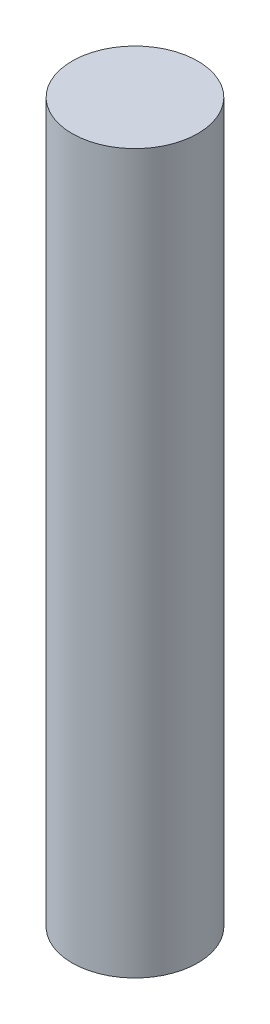
ISO-10303-21;
HEADER;
FILE_DESCRIPTION(('STEP AP214'),'2;1');
FILE_NAME('part.step','',(''),(''),'','','');
FILE_SCHEMA(('AUTOMOTIVE_DESIGN { 1 0 10303 214 1 1 1 1 }'));
ENDSEC;
DATA;
#1=APPLICATION_CONTEXT('core data for automotive mechanical design processes');
#2=APPLICATION_PROTOCOL_DEFINITION('international standard','automotive_design',2000,#1);
#3=PRODUCT_CONTEXT('',#1,'mechanical');
#4=PRODUCT('Part','Part','',(#3));
#5=PRODUCT_RELATED_PRODUCT_CATEGORY('part','',(#4));
#6=PRODUCT_DEFINITION_FORMATION('','',#4);
#7=PRODUCT_DEFINITION_CONTEXT('part definition',#1,'design');
#8=PRODUCT_DEFINITION('design','',#6,#7);
#9=PRODUCT_DEFINITION_SHAPE('','',#8);
#10=(LENGTH_UNIT() NAMED_UNIT(*) SI_UNIT(.MILLI.,.METRE.));
#11=(NAMED_UNIT(*) PLANE_ANGLE_UNIT() SI_UNIT($,.RADIAN.));
#12=(NAMED_UNIT(*) SI_UNIT($,.STERADIAN.) SOLID_ANGLE_UNIT());
#13=UNCERTAINTY_MEASURE_WITH_UNIT(LENGTH_MEASURE(1.E-05),#10,'distance_accuracy_value','');
#14=(GEOMETRIC_REPRESENTATION_CONTEXT(3) GLOBAL_UNCERTAINTY_ASSIGNED_CONTEXT((#13)) GLOBAL_UNIT_ASSIGNED_CONTEXT((#10,
#11,#12)) REPRESENTATION_CONTEXT('',''));
#15=CARTESIAN_POINT('',(0.,0.,0.));
#16=DIRECTION('',(0.,0.,1.));
#17=DIRECTION('',(1.,0.,0.));
#18=AXIS2_PLACEMENT_3D('',#15,#16,#17);
#19=CARTESIAN_POINT('',(0.,20.,0.));
#20=DIRECTION('',(0.,-1.,0.));
#21=DIRECTION('',(0.,0.,-1.));
#22=AXIS2_PLACEMENT_3D('',#19,#20,#21);
#23=CYLINDRICAL_SURFACE('',#22,1.75);
#24=CARTESIAN_POINT('',(0.,20.,0.));
#25=DIRECTION('',(0.,1.,0.));
#26=DIRECTION('',(0.,0.,1.));
#27=AXIS2_PLACEMENT_3D('',#24,#25,#26);
#28=CIRCLE('',#27,1.75);
#29=CARTESIAN_POINT('',(0.,20.,1.75));
#30=VERTEX_POINT('',#29);
#31=EDGE_CURVE('E10',#30,#30,#28,.T.);
#32=ORIENTED_EDGE('',*,*,#31,.F.);
#33=EDGE_LOOP('',(#32));
#34=FACE_BOUND('',#33,.T.);
#35=CARTESIAN_POINT('',(0.,0.,0.));
#36=DIRECTION('',(0.,1.,0.));
#37=DIRECTION('',(0.,0.,1.));
#38=AXIS2_PLACEMENT_3D('',#35,#36,#37);
#39=CIRCLE('',#38,1.75);
#40=CARTESIAN_POINT('',(0.,0.,1.75));
#41=VERTEX_POINT('',#40);
#42=EDGE_CURVE('E34',#41,#41,#39,.T.);
#43=ORIENTED_EDGE('',*,*,#42,.T.);
#44=EDGE_LOOP('',(#43));
#45=FACE_BOUND('',#44,.T.);
#46=ADVANCED_FACE('F31',(#34,#45),#23,.T.);
#47=CARTESIAN_POINT('',(0.,20.,0.));
#48=DIRECTION('',(0.,1.,0.));
#49=DIRECTION('',(0.,0.,1.));
#50=AXIS2_PLACEMENT_3D('',#47,#48,#49);
#51=PLANE('',#50);
#52=ORIENTED_EDGE('',*,*,#31,.T.);
#53=EDGE_LOOP('',(#52));
#54=FACE_BOUND('',#53,.T.);
#55=ADVANCED_FACE('F46',(#54),#51,.T.);
#56=CARTESIAN_POINT('',(0.,0.,0.));
#57=DIRECTION('',(0.,1.,0.));
#58=DIRECTION('',(0.,0.,1.));
#59=AXIS2_PLACEMENT_3D('',#56,#57,#58);
#60=PLANE('',#59);
#61=ORIENTED_EDGE('',*,*,#42,.F.);
#62=EDGE_LOOP('',(#61));
#63=FACE_BOUND('',#62,.T.);
#64=ADVANCED_FACE('F44',(#63),#60,.F.);
#65=CLOSED_SHELL('',(#46,#55,#64));
#66=MANIFOLD_SOLID_BREP('B2',#65);
#67=ADVANCED_BREP_SHAPE_REPRESENTATION('',(#18,#66),#14);
#68=SHAPE_DEFINITION_REPRESENTATION(#9,#67);
ENDSEC;
END-ISO-10303-21;
